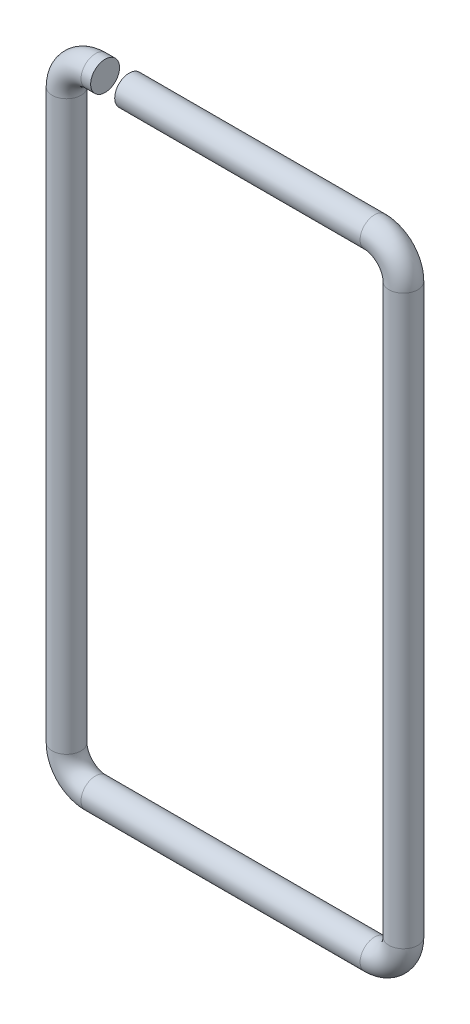
ISO-10303-21;
HEADER;
FILE_DESCRIPTION(('STEP AP214'),'2;1');
FILE_NAME('part.step','',(''),(''),'','','');
FILE_SCHEMA(('AUTOMOTIVE_DESIGN { 1 0 10303 214 1 1 1 1 }'));
ENDSEC;
DATA;
#1=APPLICATION_CONTEXT('core data for automotive mechanical design processes');
#2=APPLICATION_PROTOCOL_DEFINITION('international standard','automotive_design',2000,#1);
#3=PRODUCT_CONTEXT('',#1,'mechanical');
#4=PRODUCT('Part','Part','',(#3));
#5=PRODUCT_RELATED_PRODUCT_CATEGORY('part','',(#4));
#6=PRODUCT_DEFINITION_FORMATION('','',#4);
#7=PRODUCT_DEFINITION_CONTEXT('part definition',#1,'design');
#8=PRODUCT_DEFINITION('design','',#6,#7);
#9=PRODUCT_DEFINITION_SHAPE('','',#8);
#10=(LENGTH_UNIT() NAMED_UNIT(*) SI_UNIT(.MILLI.,.METRE.));
#11=(NAMED_UNIT(*) PLANE_ANGLE_UNIT() SI_UNIT($,.RADIAN.));
#12=(NAMED_UNIT(*) SI_UNIT($,.STERADIAN.) SOLID_ANGLE_UNIT());
#13=UNCERTAINTY_MEASURE_WITH_UNIT(LENGTH_MEASURE(1.E-05),#10,'distance_accuracy_value','');
#14=(GEOMETRIC_REPRESENTATION_CONTEXT(3) GLOBAL_UNCERTAINTY_ASSIGNED_CONTEXT((#13)) GLOBAL_UNIT_ASSIGNED_CONTEXT((#10,
#11,#12)) REPRESENTATION_CONTEXT('',''));
#15=CARTESIAN_POINT('',(0.,0.,0.));
#16=DIRECTION('',(0.,0.,1.));
#17=DIRECTION('',(1.,0.,0.));
#18=AXIS2_PLACEMENT_3D('',#15,#16,#17);
#19=CARTESIAN_POINT('',(-29.,41.0230887410269,0.));
#20=DIRECTION('',(1.,0.,0.));
#21=DIRECTION('',(0.,1.,0.));
#22=AXIS2_PLACEMENT_3D('',#19,#20,#21);
#23=CYLINDRICAL_SURFACE('',#22,3.);
#24=CARTESIAN_POINT('',(-29.,41.0230887410269,0.));
#25=DIRECTION('',(1.,0.,0.));
#26=DIRECTION('',(0.,1.,0.));
#27=AXIS2_PLACEMENT_3D('',#24,#25,#26);
#28=CIRCLE('',#27,3.);
#29=CARTESIAN_POINT('',(-29.,44.0230887410269,0.));
#30=VERTEX_POINT('',#29);
#31=EDGE_CURVE('E38',#30,#30,#28,.T.);
#32=ORIENTED_EDGE('',*,*,#31,.T.);
#33=EDGE_LOOP('',(#32));
#34=FACE_BOUND('',#33,.T.);
#35=CARTESIAN_POINT('',(-27.,41.0230887410268,0.));
#36=DIRECTION('',(1.,0.,0.));
#37=DIRECTION('',(0.,1.,0.));
#38=AXIS2_PLACEMENT_3D('',#35,#36,#37);
#39=CIRCLE('',#38,3.);
#40=CARTESIAN_POINT('',(-27.,44.0230887410268,0.));
#41=VERTEX_POINT('',#40);
#42=EDGE_CURVE('E10',#41,#41,#39,.T.);
#43=ORIENTED_EDGE('',*,*,#42,.F.);
#44=EDGE_LOOP('',(#43));
#45=FACE_BOUND('',#44,.T.);
#46=ADVANCED_FACE('F32',(#34,#45),#23,.T.);
#47=CARTESIAN_POINT('',(-29.,35.0230887410269,0.));
#48=DIRECTION('',(0.,0.,-1.));
#49=DIRECTION('',(-1.,0.,0.));
#50=AXIS2_PLACEMENT_3D('',#47,#48,#49);
#51=TOROIDAL_SURFACE('',#50,6.00000000000003,3.);
#52=CARTESIAN_POINT('',(-35.,35.0230887410269,0.));
#53=DIRECTION('',(0.,1.,0.));
#54=DIRECTION('',(-1.,0.,0.));
#55=AXIS2_PLACEMENT_3D('',#52,#53,#54);
#56=CIRCLE('',#55,3.);
#57=CARTESIAN_POINT('',(-38.,35.0230887410269,0.));
#58=VERTEX_POINT('',#57);
#59=EDGE_CURVE('E42',#58,#58,#56,.T.);
#60=CARTESIAN_POINT('',(-29.,35.0230887410269,0.));
#61=DIRECTION('',(0.,0.,-1.));
#62=DIRECTION('',(-1.,0.,0.));
#63=AXIS2_PLACEMENT_3D('',#60,#61,#62);
#64=CIRCLE('',#63,9.00000000000003);
#65=EDGE_CURVE('',#58,#30,#64,.T.);
#66=ORIENTED_EDGE('',*,*,#59,.T.);
#67=ORIENTED_EDGE('',*,*,#31,.F.);
#68=ORIENTED_EDGE('',*,*,#65,.T.);
#69=ORIENTED_EDGE('',*,*,#65,.F.);
#70=EDGE_LOOP('',(#66,#68,#67,#69));
#71=FACE_BOUND('',#70,.T.);
#72=ADVANCED_FACE('F88',(#71),#51,.T.);
#73=CARTESIAN_POINT('',(-35.,-82.9769112589732,0.));
#74=DIRECTION('',(0.,1.,0.));
#75=DIRECTION('',(-1.,0.,0.));
#76=AXIS2_PLACEMENT_3D('',#73,#74,#75);
#77=CYLINDRICAL_SURFACE('',#76,3.);
#78=CARTESIAN_POINT('',(-35.,-82.9769112589732,0.));
#79=DIRECTION('',(0.,1.,0.));
#80=DIRECTION('',(-1.,0.,0.));
#81=AXIS2_PLACEMENT_3D('',#78,#79,#80);
#82=CIRCLE('',#81,3.);
#83=CARTESIAN_POINT('',(-38.,-82.9769112589732,0.));
#84=VERTEX_POINT('',#83);
#85=EDGE_CURVE('E46',#84,#84,#82,.T.);
#86=ORIENTED_EDGE('',*,*,#85,.T.);
#87=EDGE_LOOP('',(#86));
#88=FACE_BOUND('',#87,.T.);
#89=ORIENTED_EDGE('',*,*,#59,.F.);
#90=EDGE_LOOP('',(#89));
#91=FACE_BOUND('',#90,.T.);
#92=ADVANCED_FACE('F92',(#88,#91),#77,.T.);
#93=CARTESIAN_POINT('',(-29.,-82.9769112589732,0.));
#94=DIRECTION('',(0.,0.,-1.));
#95=DIRECTION('',(-1.,0.,0.));
#96=AXIS2_PLACEMENT_3D('',#93,#94,#95);
#97=TOROIDAL_SURFACE('',#96,6.00000000000001,3.);
#98=CARTESIAN_POINT('',(-29.,-88.9769112589732,0.));
#99=DIRECTION('',(-1.,0.,0.));
#100=DIRECTION('',(0.,-1.,0.));
#101=AXIS2_PLACEMENT_3D('',#98,#99,#100);
#102=CIRCLE('',#101,3.);
#103=CARTESIAN_POINT('',(-29.,-91.9769112589732,0.));
#104=VERTEX_POINT('',#103);
#105=EDGE_CURVE('E51',#104,#104,#102,.T.);
#106=CARTESIAN_POINT('',(-29.,-82.9769112589732,0.));
#107=DIRECTION('',(0.,0.,-1.));
#108=DIRECTION('',(-1.,0.,0.));
#109=AXIS2_PLACEMENT_3D('',#106,#107,#108);
#110=CIRCLE('',#109,9.00000000000001);
#111=EDGE_CURVE('',#104,#84,#110,.T.);
#112=ORIENTED_EDGE('',*,*,#105,.T.);
#113=ORIENTED_EDGE('',*,*,#85,.F.);
#114=ORIENTED_EDGE('',*,*,#111,.T.);
#115=ORIENTED_EDGE('',*,*,#111,.F.);
#116=EDGE_LOOP('',(#112,#114,#113,#115));
#117=FACE_BOUND('',#116,.T.);
#118=ADVANCED_FACE('F98',(#117),#97,.T.);
#119=CARTESIAN_POINT('',(29.,-88.9769112589732,0.));
#120=DIRECTION('',(-1.,0.,0.));
#121=DIRECTION('',(0.,0.,1.));
#122=AXIS2_PLACEMENT_3D('',#119,#120,#121);
#123=CYLINDRICAL_SURFACE('',#122,3.);
#124=CARTESIAN_POINT('',(29.,-88.9769112589732,0.));
#125=DIRECTION('',(-1.,0.,0.));
#126=DIRECTION('',(0.,-1.,0.));
#127=AXIS2_PLACEMENT_3D('',#124,#125,#126);
#128=CIRCLE('',#127,3.);
#129=CARTESIAN_POINT('',(29.,-91.9769112589732,0.));
#130=VERTEX_POINT('',#129);
#131=EDGE_CURVE('E54',#130,#130,#128,.T.);
#132=ORIENTED_EDGE('',*,*,#131,.T.);
#133=EDGE_LOOP('',(#132));
#134=FACE_BOUND('',#133,.T.);
#135=ORIENTED_EDGE('',*,*,#105,.F.);
#136=EDGE_LOOP('',(#135));
#137=FACE_BOUND('',#136,.T.);
#138=ADVANCED_FACE('F105',(#134,#137),#123,.T.);
#139=CARTESIAN_POINT('',(29.,-82.9769112589731,0.));
#140=DIRECTION('',(0.,0.,-1.));
#141=DIRECTION('',(-1.,0.,0.));
#142=AXIS2_PLACEMENT_3D('',#139,#140,#141);
#143=TOROIDAL_SURFACE('',#142,6.,3.);
#144=CARTESIAN_POINT('',(35.,-82.9769112589731,0.));
#145=DIRECTION('',(0.,-1.,0.));
#146=DIRECTION('',(1.,0.,0.));
#147=AXIS2_PLACEMENT_3D('',#144,#145,#146);
#148=CIRCLE('',#147,3.);
#149=CARTESIAN_POINT('',(38.,-82.9769112589731,0.));
#150=VERTEX_POINT('',#149);
#151=EDGE_CURVE('E57',#150,#150,#148,.T.);
#152=CARTESIAN_POINT('',(29.,-82.9769112589731,0.));
#153=DIRECTION('',(0.,0.,-1.));
#154=DIRECTION('',(-1.,0.,0.));
#155=AXIS2_PLACEMENT_3D('',#152,#153,#154);
#156=CIRCLE('',#155,9.);
#157=EDGE_CURVE('',#150,#130,#156,.T.);
#158=ORIENTED_EDGE('',*,*,#151,.T.);
#159=ORIENTED_EDGE('',*,*,#131,.F.);
#160=ORIENTED_EDGE('',*,*,#157,.T.);
#161=ORIENTED_EDGE('',*,*,#157,.F.);
#162=EDGE_LOOP('',(#158,#160,#159,#161));
#163=FACE_BOUND('',#162,.T.);
#164=ADVANCED_FACE('F109',(#163),#143,.T.);
#165=CARTESIAN_POINT('',(35.,35.0230887410269,0.));
#166=DIRECTION('',(0.,-1.,0.));
#167=DIRECTION('',(1.,0.,0.));
#168=AXIS2_PLACEMENT_3D('',#165,#166,#167);
#169=CYLINDRICAL_SURFACE('',#168,3.);
#170=CARTESIAN_POINT('',(35.,35.0230887410269,0.));
#171=DIRECTION('',(0.,-1.,0.));
#172=DIRECTION('',(1.,0.,0.));
#173=AXIS2_PLACEMENT_3D('',#170,#171,#172);
#174=CIRCLE('',#173,3.);
#175=CARTESIAN_POINT('',(38.,35.0230887410269,0.));
#176=VERTEX_POINT('',#175);
#177=EDGE_CURVE('E60',#176,#176,#174,.T.);
#178=CARTESIAN_POINT('',(38.,35.0230887410269,0.));
#179=CARTESIAN_POINT('',(38.,33.7939220743602,0.));
#180=CARTESIAN_POINT('',(38.,32.5647554076935,0.));
#181=CARTESIAN_POINT('',(38.,30.1064220743602,0.));
#182=CARTESIAN_POINT('',(38.,28.8772554076935,0.));
#183=CARTESIAN_POINT('',(38.,26.4189220743602,0.));
#184=CARTESIAN_POINT('',(38.,25.1897554076935,0.));
#185=CARTESIAN_POINT('',(38.,22.7314220743602,0.));
#186=CARTESIAN_POINT('',(38.,21.5022554076935,0.));
#187=CARTESIAN_POINT('',(38.,19.0439220743602,0.));
#188=CARTESIAN_POINT('',(38.,17.8147554076935,0.));
#189=CARTESIAN_POINT('',(38.,15.3564220743602,0.));
#190=CARTESIAN_POINT('',(38.,14.1272554076935,0.));
#191=CARTESIAN_POINT('',(38.,11.6689220743602,0.));
#192=CARTESIAN_POINT('',(38.,10.4397554076935,0.));
#193=CARTESIAN_POINT('',(38.,7.98142207436019,0.));
#194=CARTESIAN_POINT('',(38.,6.75225540769353,0.));
#195=CARTESIAN_POINT('',(38.,4.29392207436019,0.));
#196=CARTESIAN_POINT('',(38.,3.06475540769353,0.));
#197=CARTESIAN_POINT('',(38.,0.606422074360199,0.));
#198=CARTESIAN_POINT('',(38.,-0.622744592306467,0.));
#199=CARTESIAN_POINT('',(38.,-3.0810779256398,0.));
#200=CARTESIAN_POINT('',(38.,-4.31024459230647,0.));
#201=CARTESIAN_POINT('',(38.,-6.7685779256398,0.));
#202=CARTESIAN_POINT('',(38.,-7.99774459230647,0.));
#203=CARTESIAN_POINT('',(38.,-10.4560779256398,0.));
#204=CARTESIAN_POINT('',(38.,-11.6852445923065,0.));
#205=CARTESIAN_POINT('',(38.,-14.1435779256398,0.));
#206=CARTESIAN_POINT('',(38.,-15.3727445923065,0.));
#207=CARTESIAN_POINT('',(38.,-17.8310779256398,0.));
#208=CARTESIAN_POINT('',(38.,-19.0602445923065,0.));
#209=CARTESIAN_POINT('',(38.,-21.5185779256398,0.));
#210=CARTESIAN_POINT('',(38.,-22.7477445923065,0.));
#211=CARTESIAN_POINT('',(38.,-25.2060779256398,0.));
#212=CARTESIAN_POINT('',(38.,-26.4352445923065,0.));
#213=CARTESIAN_POINT('',(38.,-28.8935779256398,0.));
#214=CARTESIAN_POINT('',(38.,-30.1227445923065,0.));
#215=CARTESIAN_POINT('',(38.,-32.5810779256398,0.));
#216=CARTESIAN_POINT('',(38.,-33.8102445923065,0.));
#217=CARTESIAN_POINT('',(38.,-36.2685779256398,0.));
#218=CARTESIAN_POINT('',(38.,-37.4977445923065,0.));
#219=CARTESIAN_POINT('',(38.,-39.9560779256398,0.));
#220=CARTESIAN_POINT('',(38.,-41.1852445923065,0.));
#221=CARTESIAN_POINT('',(38.,-43.6435779256398,0.));
#222=CARTESIAN_POINT('',(38.,-44.8727445923065,0.));
#223=CARTESIAN_POINT('',(38.,-47.3310779256398,0.));
#224=CARTESIAN_POINT('',(38.,-48.5602445923065,0.));
#225=CARTESIAN_POINT('',(38.,-51.0185779256398,0.));
#226=CARTESIAN_POINT('',(38.,-52.2477445923065,0.));
#227=CARTESIAN_POINT('',(38.,-54.7060779256398,0.));
#228=CARTESIAN_POINT('',(38.,-55.9352445923065,0.));
#229=CARTESIAN_POINT('',(38.,-58.3935779256398,0.));
#230=CARTESIAN_POINT('',(38.,-59.6227445923065,0.));
#231=CARTESIAN_POINT('',(38.,-62.0810779256398,0.));
#232=CARTESIAN_POINT('',(38.,-63.3102445923065,0.));
#233=CARTESIAN_POINT('',(38.,-65.7685779256398,0.));
#234=CARTESIAN_POINT('',(38.,-66.9977445923065,0.));
#235=CARTESIAN_POINT('',(38.,-69.4560779256398,0.));
#236=CARTESIAN_POINT('',(38.,-70.6852445923065,0.));
#237=CARTESIAN_POINT('',(38.,-73.1435779256398,0.));
#238=CARTESIAN_POINT('',(38.,-74.3727445923065,0.));
#239=CARTESIAN_POINT('',(38.,-76.8310779256398,0.));
#240=CARTESIAN_POINT('',(38.,-78.0602445923065,0.));
#241=CARTESIAN_POINT('',(38.,-80.5185779256398,0.));
#242=CARTESIAN_POINT('',(38.,-81.7477445923065,0.));
#243=CARTESIAN_POINT('',(38.,-82.9769112589731,0.));
#244=B_SPLINE_CURVE_WITH_KNOTS('',3,(#178,#179,#180,#181,#182,#183,#184,#185,#186,#187,#188,
#189,#190,#191,#192,#193,#194,#195,#196,#197,#198,#199,#200,#201,#202,#203,#204,#205,#206,#207,
#208,#209,#210,#211,#212,#213,#214,#215,#216,#217,#218,#219,#220,#221,#222,#223,#224,#225,#226,
#227,#228,#229,#230,#231,#232,#233,#234,#235,#236,#237,#238,#239,#240,#241,#242,#243),
.UNSPECIFIED.,.F.,.F.,(4,2,2,2,2,2,2,2,2,2,2,2,2,2,2,2,2,2,2,2,2,2,2,2,2,2,2,2,2,2,2,2,4),(0.,
3.6875,7.375,11.0625,14.75,18.4375,22.125,25.8125,29.5,33.1875,36.875,40.5625,44.25,47.9375,
51.625,55.3125,59.,62.6875,66.375,70.0625,73.75,77.4375,81.125,84.8125,88.5,92.1875,95.875,
99.5625,103.25,106.9375,110.625,114.3125,118.),.UNSPECIFIED.);
#245=EDGE_CURVE('BSEAM113',#176,#150,#244,.T.);
#246=ORIENTED_EDGE('',*,*,#177,.T.);
#247=ORIENTED_EDGE('',*,*,#151,.F.);
#248=ORIENTED_EDGE('',*,*,#245,.T.);
#249=ORIENTED_EDGE('',*,*,#245,.F.);
#250=EDGE_LOOP('',(#246,#248,#247,#249));
#251=FACE_BOUND('',#250,.T.);
#252=ADVANCED_FACE('F113',(#251),#169,.T.);
#253=CARTESIAN_POINT('',(29.,35.0230887410269,0.));
#254=DIRECTION('',(0.,0.,-1.));
#255=DIRECTION('',(-1.,0.,0.));
#256=AXIS2_PLACEMENT_3D('',#253,#254,#255);
#257=TOROIDAL_SURFACE('',#256,6.,3.);
#258=CARTESIAN_POINT('',(29.,41.0230887410269,0.));
#259=DIRECTION('',(1.,0.,0.));
#260=DIRECTION('',(0.,1.,0.));
#261=AXIS2_PLACEMENT_3D('',#258,#259,#260);
#262=CIRCLE('',#261,3.);
#263=CARTESIAN_POINT('',(29.,44.0230887410269,0.));
#264=VERTEX_POINT('',#263);
#265=EDGE_CURVE('E63',#264,#264,#262,.T.);
#266=CARTESIAN_POINT('',(29.,35.0230887410269,0.));
#267=DIRECTION('',(0.,0.,-1.));
#268=DIRECTION('',(-1.,0.,0.));
#269=AXIS2_PLACEMENT_3D('',#266,#267,#268);
#270=CIRCLE('',#269,9.);
#271=EDGE_CURVE('',#264,#176,#270,.T.);
#272=ORIENTED_EDGE('',*,*,#265,.T.);
#273=ORIENTED_EDGE('',*,*,#177,.F.);
#274=ORIENTED_EDGE('',*,*,#271,.T.);
#275=ORIENTED_EDGE('',*,*,#271,.F.);
#276=EDGE_LOOP('',(#272,#274,#273,#275));
#277=FACE_BOUND('',#276,.T.);
#278=ADVANCED_FACE('F70',(#277),#257,.T.);
#279=CARTESIAN_POINT('',(29.,41.0230887410269,0.));
#280=DIRECTION('',(-1.,0.,0.));
#281=DIRECTION('',(0.,-1.,0.));
#282=AXIS2_PLACEMENT_3D('',#279,#280,#281);
#283=CYLINDRICAL_SURFACE('',#282,3.);
#284=ORIENTED_EDGE('',*,*,#265,.F.);
#285=EDGE_LOOP('',(#284));
#286=FACE_BOUND('',#285,.T.);
#287=CARTESIAN_POINT('',(-22.,41.0230887410268,0.));
#288=DIRECTION('',(1.,0.,0.));
#289=DIRECTION('',(0.,1.,0.));
#290=AXIS2_PLACEMENT_3D('',#287,#288,#289);
#291=CIRCLE('',#290,3.);
#292=CARTESIAN_POINT('',(-22.,44.0230887410268,0.));
#293=VERTEX_POINT('',#292);
#294=EDGE_CURVE('E64',#293,#293,#291,.T.);
#295=ORIENTED_EDGE('',*,*,#294,.T.);
#296=EDGE_LOOP('',(#295));
#297=FACE_BOUND('',#296,.T.);
#298=ADVANCED_FACE('F73',(#286,#297),#283,.T.);
#299=CARTESIAN_POINT('',(-27.,41.0230887410268,0.));
#300=DIRECTION('',(1.,0.,0.));
#301=DIRECTION('',(0.,1.,0.));
#302=AXIS2_PLACEMENT_3D('',#299,#300,#301);
#303=PLANE('',#302);
#304=ORIENTED_EDGE('',*,*,#42,.T.);
#305=EDGE_LOOP('',(#304));
#306=FACE_BOUND('',#305,.T.);
#307=ADVANCED_FACE('F76',(#306),#303,.T.);
#308=CARTESIAN_POINT('',(-22.,41.0230887410268,0.));
#309=DIRECTION('',(1.,0.,0.));
#310=DIRECTION('',(0.,1.,0.));
#311=AXIS2_PLACEMENT_3D('',#308,#309,#310);
#312=PLANE('',#311);
#313=ORIENTED_EDGE('',*,*,#294,.F.);
#314=EDGE_LOOP('',(#313));
#315=FACE_BOUND('',#314,.T.);
#316=ADVANCED_FACE('F80',(#315),#312,.F.);
#317=CLOSED_SHELL('',(#46,#72,#92,#118,#138,#164,#252,#278,#298,#307,#316));
#318=MANIFOLD_SOLID_BREP('B2',#317);
#319=ADVANCED_BREP_SHAPE_REPRESENTATION('',(#18,#318),#14);
#320=SHAPE_DEFINITION_REPRESENTATION(#9,#319);
ENDSEC;
END-ISO-10303-21;
